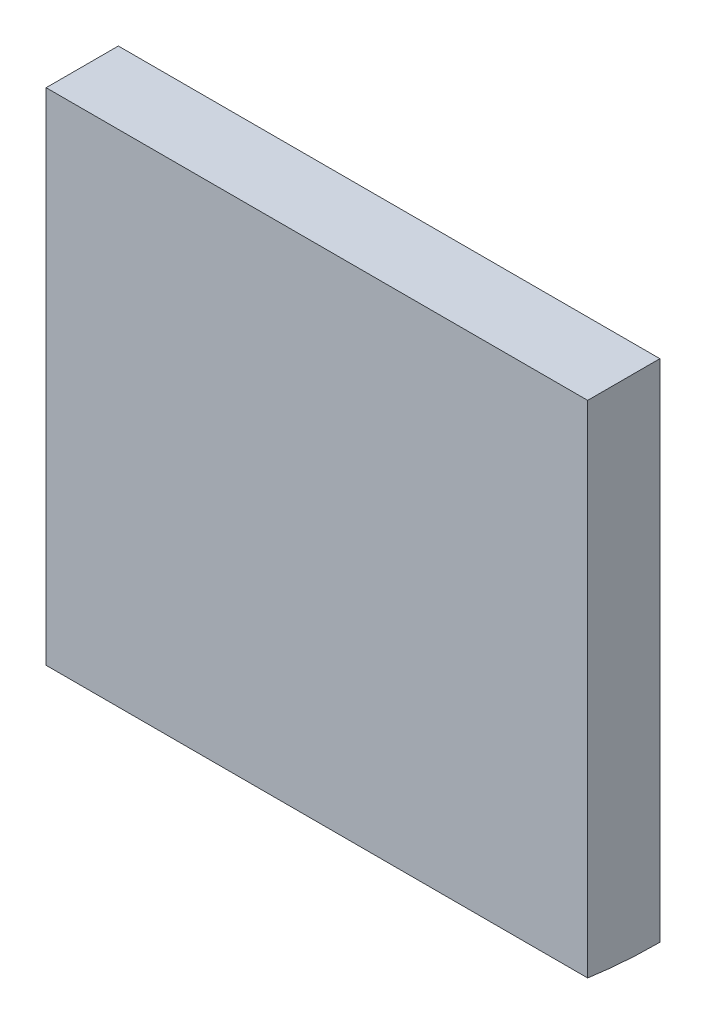
ISO-10303-21;
HEADER;
FILE_DESCRIPTION(('STEP AP214'),'2;1');
FILE_NAME('part.step','',(''),(''),'','','');
FILE_SCHEMA(('AUTOMOTIVE_DESIGN { 1 0 10303 214 1 1 1 1 }'));
ENDSEC;
DATA;
#1=APPLICATION_CONTEXT('core data for automotive mechanical design processes');
#2=APPLICATION_PROTOCOL_DEFINITION('international standard','automotive_design',2000,#1);
#3=PRODUCT_CONTEXT('',#1,'mechanical');
#4=PRODUCT('Part','Part','',(#3));
#5=PRODUCT_RELATED_PRODUCT_CATEGORY('part','',(#4));
#6=PRODUCT_DEFINITION_FORMATION('','',#4);
#7=PRODUCT_DEFINITION_CONTEXT('part definition',#1,'design');
#8=PRODUCT_DEFINITION('design','',#6,#7);
#9=PRODUCT_DEFINITION_SHAPE('','',#8);
#10=(LENGTH_UNIT() NAMED_UNIT(*) SI_UNIT(.MILLI.,.METRE.));
#11=(NAMED_UNIT(*) PLANE_ANGLE_UNIT() SI_UNIT($,.RADIAN.));
#12=(NAMED_UNIT(*) SI_UNIT($,.STERADIAN.) SOLID_ANGLE_UNIT());
#13=UNCERTAINTY_MEASURE_WITH_UNIT(LENGTH_MEASURE(1.E-05),#10,'distance_accuracy_value','');
#14=(GEOMETRIC_REPRESENTATION_CONTEXT(3) GLOBAL_UNCERTAINTY_ASSIGNED_CONTEXT((#13)) GLOBAL_UNIT_ASSIGNED_CONTEXT((#10,
#11,#12)) REPRESENTATION_CONTEXT('',''));
#15=CARTESIAN_POINT('',(0.,0.,0.));
#16=DIRECTION('',(0.,0.,1.));
#17=DIRECTION('',(1.,0.,0.));
#18=AXIS2_PLACEMENT_3D('',#15,#16,#17);
#19=CARTESIAN_POINT('',(75.,-70.,20.));
#20=DIRECTION('',(-1.,0.,0.));
#21=DIRECTION('',(0.,0.,1.));
#22=AXIS2_PLACEMENT_3D('',#19,#20,#21);
#23=PLANE('',#22);
#24=DIRECTION('',(0.,1.,0.));
#25=VECTOR('',#24,1.);
#26=CARTESIAN_POINT('',(75.,-70.,20.));
#27=LINE('',#26,#25);
#28=CARTESIAN_POINT('',(75.,-68.5640646055102,20.));
#29=VERTEX_POINT('',#28);
#30=CARTESIAN_POINT('',(75.,70.,20.));
#31=VERTEX_POINT('',#30);
#32=EDGE_CURVE('E91',#29,#31,#27,.T.);
#33=ORIENTED_EDGE('',*,*,#32,.F.);
#34=CARTESIAN_POINT('',(75.,70.,0.));
#35=DIRECTION('',(-1.,0.,0.));
#36=DIRECTION('',(0.,0.,1.));
#37=AXIS2_PLACEMENT_3D('',#34,#35,#36);
#38=CIRCLE('',#37,140.);
#39=CARTESIAN_POINT('',(75.,-70.,0.));
#40=VERTEX_POINT('',#39);
#41=EDGE_CURVE('E80',#40,#29,#38,.T.);
#42=ORIENTED_EDGE('',*,*,#41,.F.);
#43=DIRECTION('',(0.,1.,0.));
#44=VECTOR('',#43,1.);
#45=CARTESIAN_POINT('',(75.,-70.,0.));
#46=LINE('',#45,#44);
#47=CARTESIAN_POINT('',(75.,70.,0.));
#48=VERTEX_POINT('',#47);
#49=EDGE_CURVE('E90',#40,#48,#46,.T.);
#50=ORIENTED_EDGE('',*,*,#49,.T.);
#51=DIRECTION('',(0.,0.,-1.));
#52=VECTOR('',#51,1.);
#53=CARTESIAN_POINT('',(75.,70.,20.));
#54=LINE('',#53,#52);
#55=EDGE_CURVE('E11',#31,#48,#54,.T.);
#56=ORIENTED_EDGE('',*,*,#55,.F.);
#57=EDGE_LOOP('',(#33,#42,#50,#56));
#58=FACE_BOUND('',#57,.T.);
#59=ADVANCED_FACE('F33',(#58),#23,.F.);
#60=CARTESIAN_POINT('',(-75.,70.,20.));
#61=DIRECTION('',(0.,-1.,0.));
#62=DIRECTION('',(0.,0.,-1.));
#63=AXIS2_PLACEMENT_3D('',#60,#61,#62);
#64=PLANE('',#63);
#65=DIRECTION('',(-1.,0.,0.));
#66=VECTOR('',#65,1.);
#67=CARTESIAN_POINT('',(-75.,70.,0.));
#68=LINE('',#67,#66);
#69=CARTESIAN_POINT('',(-75.,70.,0.));
#70=VERTEX_POINT('',#69);
#71=EDGE_CURVE('E60',#48,#70,#68,.T.);
#72=ORIENTED_EDGE('',*,*,#71,.T.);
#73=DIRECTION('',(0.,0.,-1.));
#74=VECTOR('',#73,1.);
#75=CARTESIAN_POINT('',(-75.,70.,20.));
#76=LINE('',#75,#74);
#77=CARTESIAN_POINT('',(-75.,70.,20.));
#78=VERTEX_POINT('',#77);
#79=EDGE_CURVE('E41',#78,#70,#76,.T.);
#80=ORIENTED_EDGE('',*,*,#79,.F.);
#81=DIRECTION('',(-1.,0.,0.));
#82=VECTOR('',#81,1.);
#83=CARTESIAN_POINT('',(-75.,70.,20.));
#84=LINE('',#83,#82);
#85=EDGE_CURVE('E49',#31,#78,#84,.T.);
#86=ORIENTED_EDGE('',*,*,#85,.F.);
#87=ORIENTED_EDGE('',*,*,#55,.T.);
#88=EDGE_LOOP('',(#72,#80,#86,#87));
#89=FACE_BOUND('',#88,.T.);
#90=ADVANCED_FACE('F105',(#89),#64,.F.);
#91=CARTESIAN_POINT('',(-75.,-70.,20.));
#92=DIRECTION('',(1.,0.,0.));
#93=DIRECTION('',(0.,0.,-1.));
#94=AXIS2_PLACEMENT_3D('',#91,#92,#93);
#95=PLANE('',#94);
#96=DIRECTION('',(0.,-1.,0.));
#97=VECTOR('',#96,1.);
#98=CARTESIAN_POINT('',(-75.,-70.,0.));
#99=LINE('',#98,#97);
#100=CARTESIAN_POINT('',(-75.,-70.,0.));
#101=VERTEX_POINT('',#100);
#102=EDGE_CURVE('E83',#70,#101,#99,.T.);
#103=ORIENTED_EDGE('',*,*,#102,.T.);
#104=CARTESIAN_POINT('',(-75.,70.,0.));
#105=DIRECTION('',(1.,0.,0.));
#106=DIRECTION('',(0.,0.,1.));
#107=AXIS2_PLACEMENT_3D('',#104,#105,#106);
#108=CIRCLE('',#107,140.);
#109=CARTESIAN_POINT('',(-75.,-68.5640646055102,20.));
#110=VERTEX_POINT('',#109);
#111=EDGE_CURVE('E67',#110,#101,#108,.T.);
#112=ORIENTED_EDGE('',*,*,#111,.F.);
#113=DIRECTION('',(0.,-1.,0.));
#114=VECTOR('',#113,1.);
#115=CARTESIAN_POINT('',(-75.,-70.,20.));
#116=LINE('',#115,#114);
#117=EDGE_CURVE('E95',#78,#110,#116,.T.);
#118=ORIENTED_EDGE('',*,*,#117,.F.);
#119=ORIENTED_EDGE('',*,*,#79,.T.);
#120=EDGE_LOOP('',(#103,#112,#118,#119));
#121=FACE_BOUND('',#120,.T.);
#122=ADVANCED_FACE('F84',(#121),#95,.F.);
#123=CARTESIAN_POINT('',(0.,0.,20.));
#124=DIRECTION('',(0.,0.,-1.));
#125=DIRECTION('',(-1.,0.,0.));
#126=AXIS2_PLACEMENT_3D('',#123,#124,#125);
#127=PLANE('',#126);
#128=ORIENTED_EDGE('',*,*,#117,.T.);
#129=DIRECTION('',(-1.,0.,0.));
#130=VECTOR('',#129,1.);
#131=CARTESIAN_POINT('',(75.001,-68.5640646055102,20.));
#132=LINE('',#131,#130);
#133=EDGE_CURVE('E77',#29,#110,#132,.T.);
#134=ORIENTED_EDGE('',*,*,#133,.F.);
#135=ORIENTED_EDGE('',*,*,#32,.T.);
#136=ORIENTED_EDGE('',*,*,#85,.T.);
#137=EDGE_LOOP('',(#128,#134,#135,#136));
#138=FACE_BOUND('',#137,.T.);
#139=ADVANCED_FACE('F104',(#138),#127,.F.);
#140=CARTESIAN_POINT('',(0.,0.,0.));
#141=DIRECTION('',(0.,0.,-1.));
#142=DIRECTION('',(-1.,0.,0.));
#143=AXIS2_PLACEMENT_3D('',#140,#141,#142);
#144=PLANE('',#143);
#145=ORIENTED_EDGE('',*,*,#49,.F.);
#146=DIRECTION('',(1.,0.,0.));
#147=VECTOR('',#146,1.);
#148=CARTESIAN_POINT('',(-75.,-70.,0.));
#149=LINE('',#148,#147);
#150=EDGE_CURVE('E73',#101,#40,#149,.T.);
#151=ORIENTED_EDGE('',*,*,#150,.F.);
#152=ORIENTED_EDGE('',*,*,#102,.F.);
#153=ORIENTED_EDGE('',*,*,#71,.F.);
#154=EDGE_LOOP('',(#145,#151,#152,#153));
#155=FACE_BOUND('',#154,.T.);
#156=ADVANCED_FACE('F88',(#155),#144,.T.);
#157=CARTESIAN_POINT('',(75.001,70.,0.));
#158=DIRECTION('',(-1.,0.,0.));
#159=DIRECTION('',(0.,0.,1.));
#160=AXIS2_PLACEMENT_3D('',#157,#158,#159);
#161=CYLINDRICAL_SURFACE('',#160,140.);
#162=ORIENTED_EDGE('',*,*,#41,.T.);
#163=ORIENTED_EDGE('',*,*,#133,.T.);
#164=ORIENTED_EDGE('',*,*,#111,.T.);
#165=ORIENTED_EDGE('',*,*,#150,.T.);
#166=EDGE_LOOP('',(#162,#163,#164,#165));
#167=FACE_BOUND('',#166,.T.);
#168=ADVANCED_FACE('F70',(#167),#161,.T.);
#169=CLOSED_SHELL('',(#59,#90,#122,#139,#156,#168));
#170=MANIFOLD_SOLID_BREP('B2',#169);
#171=ADVANCED_BREP_SHAPE_REPRESENTATION('',(#18,#170),#14);
#172=SHAPE_DEFINITION_REPRESENTATION(#9,#171);
ENDSEC;
END-ISO-10303-21;
